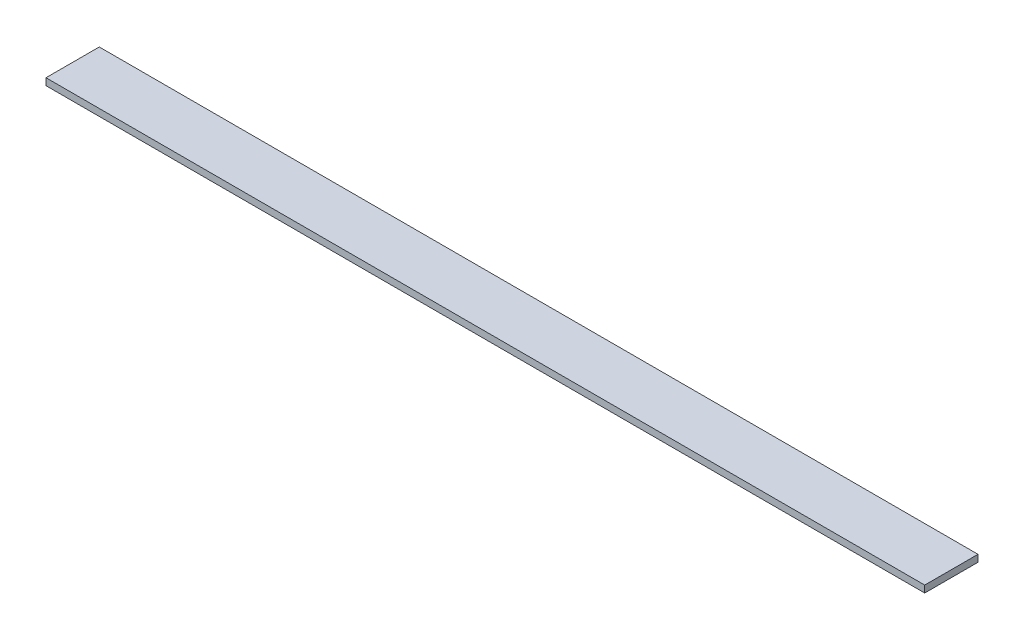
ISO-10303-21;
HEADER;
FILE_DESCRIPTION(('STEP AP214'),'2;1');
FILE_NAME('part.step','',(''),(''),'','','');
FILE_SCHEMA(('AUTOMOTIVE_DESIGN { 1 0 10303 214 1 1 1 1 }'));
ENDSEC;
DATA;
#1=APPLICATION_CONTEXT('core data for automotive mechanical design processes');
#2=APPLICATION_PROTOCOL_DEFINITION('international standard','automotive_design',2000,#1);
#3=PRODUCT_CONTEXT('',#1,'mechanical');
#4=PRODUCT('Part','Part','',(#3));
#5=PRODUCT_RELATED_PRODUCT_CATEGORY('part','',(#4));
#6=PRODUCT_DEFINITION_FORMATION('','',#4);
#7=PRODUCT_DEFINITION_CONTEXT('part definition',#1,'design');
#8=PRODUCT_DEFINITION('design','',#6,#7);
#9=PRODUCT_DEFINITION_SHAPE('','',#8);
#10=(LENGTH_UNIT() NAMED_UNIT(*) SI_UNIT(.MILLI.,.METRE.));
#11=(NAMED_UNIT(*) PLANE_ANGLE_UNIT() SI_UNIT($,.RADIAN.));
#12=(NAMED_UNIT(*) SI_UNIT($,.STERADIAN.) SOLID_ANGLE_UNIT());
#13=UNCERTAINTY_MEASURE_WITH_UNIT(LENGTH_MEASURE(1.E-05),#10,'distance_accuracy_value','');
#14=(GEOMETRIC_REPRESENTATION_CONTEXT(3) GLOBAL_UNCERTAINTY_ASSIGNED_CONTEXT((#13)) GLOBAL_UNIT_ASSIGNED_CONTEXT((#10,
#11,#12)) REPRESENTATION_CONTEXT('',''));
#15=CARTESIAN_POINT('',(0.,0.,0.));
#16=DIRECTION('',(0.,0.,1.));
#17=DIRECTION('',(1.,0.,0.));
#18=AXIS2_PLACEMENT_3D('',#15,#16,#17);
#19=CARTESIAN_POINT('',(322.58,0.,0.));
#20=DIRECTION('',(0.,0.,-1.));
#21=DIRECTION('',(0.,1.,0.));
#22=AXIS2_PLACEMENT_3D('',#19,#20,#21);
#23=PLANE('',#22);
#24=DIRECTION('',(0.,-1.,0.));
#25=VECTOR('',#24,1.);
#26=CARTESIAN_POINT('',(0.,0.,0.));
#27=LINE('',#26,#25);
#28=CARTESIAN_POINT('',(0.,2.54,0.));
#29=VERTEX_POINT('',#28);
#30=CARTESIAN_POINT('',(0.,0.,0.));
#31=VERTEX_POINT('',#30);
#32=EDGE_CURVE('E96',#29,#31,#27,.T.);
#33=ORIENTED_EDGE('',*,*,#32,.T.);
#34=DIRECTION('',(-1.,0.,0.));
#35=VECTOR('',#34,1.);
#36=CARTESIAN_POINT('',(322.58,0.,0.));
#37=LINE('',#36,#35);
#38=CARTESIAN_POINT('',(322.58,0.,0.));
#39=VERTEX_POINT('',#38);
#40=EDGE_CURVE('E11',#39,#31,#37,.T.);
#41=ORIENTED_EDGE('',*,*,#40,.F.);
#42=DIRECTION('',(0.,-1.,0.));
#43=VECTOR('',#42,1.);
#44=CARTESIAN_POINT('',(322.58,0.,0.));
#45=LINE('',#44,#43);
#46=CARTESIAN_POINT('',(322.58,2.54,0.));
#47=VERTEX_POINT('',#46);
#48=EDGE_CURVE('E84',#47,#39,#45,.T.);
#49=ORIENTED_EDGE('',*,*,#48,.F.);
#50=DIRECTION('',(-1.,0.,0.));
#51=VECTOR('',#50,1.);
#52=CARTESIAN_POINT('',(322.58,2.54,0.));
#53=LINE('',#52,#51);
#54=EDGE_CURVE('E92',#47,#29,#53,.T.);
#55=ORIENTED_EDGE('',*,*,#54,.T.);
#56=EDGE_LOOP('',(#33,#41,#49,#55));
#57=FACE_BOUND('',#56,.T.);
#58=ADVANCED_FACE('F33',(#57),#23,.F.);
#59=CARTESIAN_POINT('',(322.58,0.,0.));
#60=DIRECTION('',(0.,1.,0.));
#61=DIRECTION('',(0.,0.,1.));
#62=AXIS2_PLACEMENT_3D('',#59,#60,#61);
#63=PLANE('',#62);
#64=DIRECTION('',(0.,0.,-1.));
#65=VECTOR('',#64,1.);
#66=CARTESIAN_POINT('',(0.,0.,0.));
#67=LINE('',#66,#65);
#68=CARTESIAN_POINT('',(0.,0.,-19.558));
#69=VERTEX_POINT('',#68);
#70=EDGE_CURVE('E88',#31,#69,#67,.T.);
#71=ORIENTED_EDGE('',*,*,#70,.T.);
#72=DIRECTION('',(-1.,0.,0.));
#73=VECTOR('',#72,1.);
#74=CARTESIAN_POINT('',(322.58,0.,-19.558));
#75=LINE('',#74,#73);
#76=CARTESIAN_POINT('',(322.58,0.,-19.558));
#77=VERTEX_POINT('',#76);
#78=EDGE_CURVE('E41',#77,#69,#75,.T.);
#79=ORIENTED_EDGE('',*,*,#78,.F.);
#80=DIRECTION('',(0.,0.,-1.));
#81=VECTOR('',#80,1.);
#82=CARTESIAN_POINT('',(322.58,0.,0.));
#83=LINE('',#82,#81);
#84=EDGE_CURVE('E79',#39,#77,#83,.T.);
#85=ORIENTED_EDGE('',*,*,#84,.F.);
#86=ORIENTED_EDGE('',*,*,#40,.T.);
#87=EDGE_LOOP('',(#71,#79,#85,#86));
#88=FACE_BOUND('',#87,.T.);
#89=ADVANCED_FACE('F87',(#88),#63,.F.);
#90=CARTESIAN_POINT('',(322.58,0.,-19.558));
#91=DIRECTION('',(0.,0.,1.));
#92=DIRECTION('',(1.,0.,0.));
#93=AXIS2_PLACEMENT_3D('',#90,#91,#92);
#94=PLANE('',#93);
#95=DIRECTION('',(0.,1.,0.));
#96=VECTOR('',#95,1.);
#97=CARTESIAN_POINT('',(0.,0.,-19.558));
#98=LINE('',#97,#96);
#99=CARTESIAN_POINT('',(0.,2.54,-19.558));
#100=VERTEX_POINT('',#99);
#101=EDGE_CURVE('E66',#69,#100,#98,.T.);
#102=ORIENTED_EDGE('',*,*,#101,.T.);
#103=DIRECTION('',(-1.,0.,0.));
#104=VECTOR('',#103,1.);
#105=CARTESIAN_POINT('',(322.58,2.54,-19.558));
#106=LINE('',#105,#104);
#107=CARTESIAN_POINT('',(322.58,2.54,-19.558));
#108=VERTEX_POINT('',#107);
#109=EDGE_CURVE('E89',#108,#100,#106,.T.);
#110=ORIENTED_EDGE('',*,*,#109,.F.);
#111=DIRECTION('',(0.,1.,0.));
#112=VECTOR('',#111,1.);
#113=CARTESIAN_POINT('',(322.58,0.,-19.558));
#114=LINE('',#113,#112);
#115=EDGE_CURVE('E82',#77,#108,#114,.T.);
#116=ORIENTED_EDGE('',*,*,#115,.F.);
#117=ORIENTED_EDGE('',*,*,#78,.T.);
#118=EDGE_LOOP('',(#102,#110,#116,#117));
#119=FACE_BOUND('',#118,.T.);
#120=ADVANCED_FACE('F90',(#119),#94,.F.);
#121=CARTESIAN_POINT('',(322.58,2.54,0.));
#122=DIRECTION('',(0.,-1.,0.));
#123=DIRECTION('',(0.,0.,-1.));
#124=AXIS2_PLACEMENT_3D('',#121,#122,#123);
#125=PLANE('',#124);
#126=DIRECTION('',(0.,0.,1.));
#127=VECTOR('',#126,1.);
#128=CARTESIAN_POINT('',(0.,2.54,0.));
#129=LINE('',#128,#127);
#130=EDGE_CURVE('E72',#100,#29,#129,.T.);
#131=ORIENTED_EDGE('',*,*,#130,.T.);
#132=ORIENTED_EDGE('',*,*,#54,.F.);
#133=DIRECTION('',(0.,0.,1.));
#134=VECTOR('',#133,1.);
#135=CARTESIAN_POINT('',(322.58,2.54,0.));
#136=LINE('',#135,#134);
#137=EDGE_CURVE('E49',#108,#47,#136,.T.);
#138=ORIENTED_EDGE('',*,*,#137,.F.);
#139=ORIENTED_EDGE('',*,*,#109,.T.);
#140=EDGE_LOOP('',(#131,#132,#138,#139));
#141=FACE_BOUND('',#140,.T.);
#142=ADVANCED_FACE('F103',(#141),#125,.F.);
#143=CARTESIAN_POINT('',(322.58,0.,0.));
#144=DIRECTION('',(-1.,0.,0.));
#145=DIRECTION('',(0.,0.,1.));
#146=AXIS2_PLACEMENT_3D('',#143,#144,#145);
#147=PLANE('',#146);
#148=ORIENTED_EDGE('',*,*,#48,.T.);
#149=ORIENTED_EDGE('',*,*,#84,.T.);
#150=ORIENTED_EDGE('',*,*,#115,.T.);
#151=ORIENTED_EDGE('',*,*,#137,.T.);
#152=EDGE_LOOP('',(#148,#149,#150,#151));
#153=FACE_BOUND('',#152,.T.);
#154=ADVANCED_FACE('F80',(#153),#147,.F.);
#155=CARTESIAN_POINT('',(0.,0.,0.));
#156=DIRECTION('',(-1.,0.,0.));
#157=DIRECTION('',(0.,0.,1.));
#158=AXIS2_PLACEMENT_3D('',#155,#156,#157);
#159=PLANE('',#158);
#160=ORIENTED_EDGE('',*,*,#32,.F.);
#161=ORIENTED_EDGE('',*,*,#130,.F.);
#162=ORIENTED_EDGE('',*,*,#101,.F.);
#163=ORIENTED_EDGE('',*,*,#70,.F.);
#164=EDGE_LOOP('',(#160,#161,#162,#163));
#165=FACE_BOUND('',#164,.T.);
#166=ADVANCED_FACE('F106',(#165),#159,.T.);
#167=CLOSED_SHELL('',(#58,#89,#120,#142,#154,#166));
#168=MANIFOLD_SOLID_BREP('B2',#167);
#169=ADVANCED_BREP_SHAPE_REPRESENTATION('',(#18,#168),#14);
#170=SHAPE_DEFINITION_REPRESENTATION(#9,#169);
ENDSEC;
END-ISO-10303-21;
